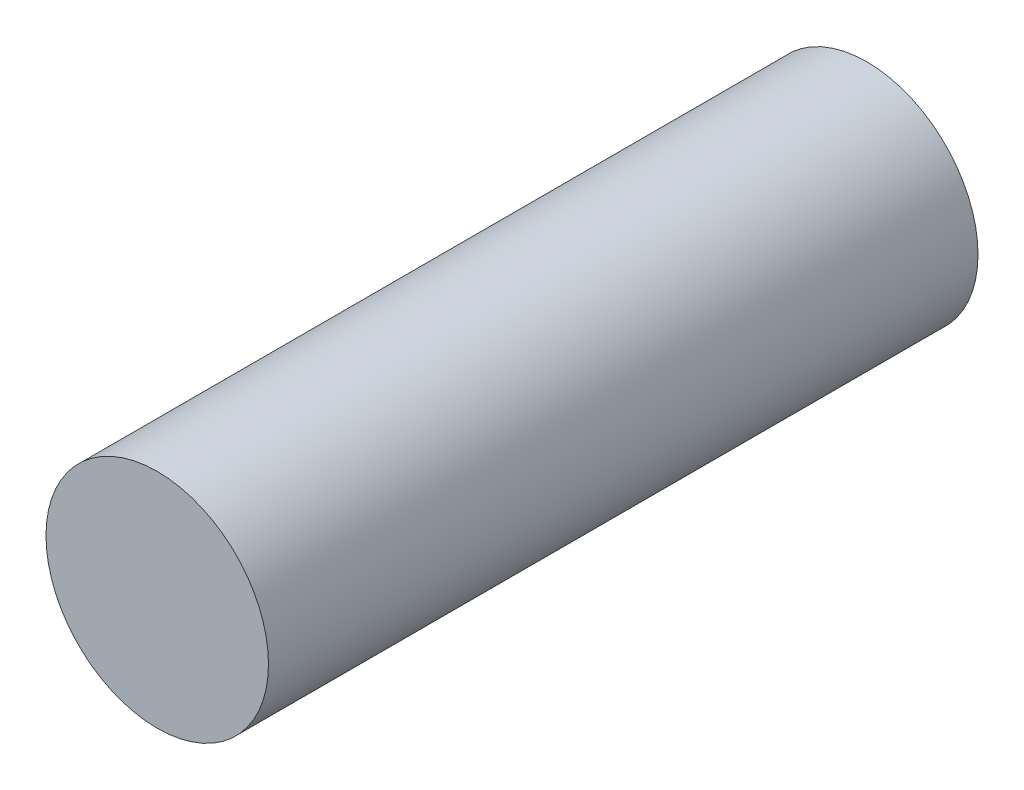
ISO-10303-21;
HEADER;
FILE_DESCRIPTION(('STEP AP214'),'2;1');
FILE_NAME('part.step','',(''),(''),'','','');
FILE_SCHEMA(('AUTOMOTIVE_DESIGN { 1 0 10303 214 1 1 1 1 }'));
ENDSEC;
DATA;
#1=APPLICATION_CONTEXT('core data for automotive mechanical design processes');
#2=APPLICATION_PROTOCOL_DEFINITION('international standard','automotive_design',2000,#1);
#3=PRODUCT_CONTEXT('',#1,'mechanical');
#4=PRODUCT('Part','Part','',(#3));
#5=PRODUCT_RELATED_PRODUCT_CATEGORY('part','',(#4));
#6=PRODUCT_DEFINITION_FORMATION('','',#4);
#7=PRODUCT_DEFINITION_CONTEXT('part definition',#1,'design');
#8=PRODUCT_DEFINITION('design','',#6,#7);
#9=PRODUCT_DEFINITION_SHAPE('','',#8);
#10=(LENGTH_UNIT() NAMED_UNIT(*) SI_UNIT(.MILLI.,.METRE.));
#11=(NAMED_UNIT(*) PLANE_ANGLE_UNIT() SI_UNIT($,.RADIAN.));
#12=(NAMED_UNIT(*) SI_UNIT($,.STERADIAN.) SOLID_ANGLE_UNIT());
#13=UNCERTAINTY_MEASURE_WITH_UNIT(LENGTH_MEASURE(1.E-05),#10,'distance_accuracy_value','');
#14=(GEOMETRIC_REPRESENTATION_CONTEXT(3) GLOBAL_UNCERTAINTY_ASSIGNED_CONTEXT((#13)) GLOBAL_UNIT_ASSIGNED_CONTEXT((#10,
#11,#12)) REPRESENTATION_CONTEXT('',''));
#15=CARTESIAN_POINT('',(0.,0.,0.));
#16=DIRECTION('',(0.,0.,1.));
#17=DIRECTION('',(1.,0.,0.));
#18=AXIS2_PLACEMENT_3D('',#15,#16,#17);
#19=CARTESIAN_POINT('',(0.,0.,13.3));
#20=DIRECTION('',(0.,0.,-1.));
#21=DIRECTION('',(-1.,0.,0.));
#22=AXIS2_PLACEMENT_3D('',#19,#20,#21);
#23=CYLINDRICAL_SURFACE('',#22,4.17);
#24=CARTESIAN_POINT('',(0.,0.,13.3));
#25=DIRECTION('',(0.,0.,1.));
#26=DIRECTION('',(1.,0.,0.));
#27=AXIS2_PLACEMENT_3D('',#24,#25,#26);
#28=CIRCLE('',#27,4.17);
#29=CARTESIAN_POINT('',(4.17,0.,13.3));
#30=VERTEX_POINT('',#29);
#31=EDGE_CURVE('E10',#30,#30,#28,.T.);
#32=ORIENTED_EDGE('',*,*,#31,.F.);
#33=EDGE_LOOP('',(#32));
#34=FACE_BOUND('',#33,.T.);
#35=CARTESIAN_POINT('',(0.,0.,-13.3));
#36=DIRECTION('',(0.,0.,1.));
#37=DIRECTION('',(1.,0.,0.));
#38=AXIS2_PLACEMENT_3D('',#35,#36,#37);
#39=CIRCLE('',#38,4.17);
#40=CARTESIAN_POINT('',(4.17,0.,-13.3));
#41=VERTEX_POINT('',#40);
#42=EDGE_CURVE('E46',#41,#41,#39,.T.);
#43=ORIENTED_EDGE('',*,*,#42,.T.);
#44=EDGE_LOOP('',(#43));
#45=FACE_BOUND('',#44,.T.);
#46=ADVANCED_FACE('F43',(#34,#45),#23,.T.);
#47=CARTESIAN_POINT('',(0.,0.,13.3));
#48=DIRECTION('',(0.,0.,1.));
#49=DIRECTION('',(1.,0.,0.));
#50=AXIS2_PLACEMENT_3D('',#47,#48,#49);
#51=PLANE('',#50);
#52=ORIENTED_EDGE('',*,*,#31,.T.);
#53=EDGE_LOOP('',(#52));
#54=FACE_BOUND('',#53,.T.);
#55=ADVANCED_FACE('F58',(#54),#51,.T.);
#56=CARTESIAN_POINT('',(0.,0.,-13.3));
#57=DIRECTION('',(0.,0.,1.));
#58=DIRECTION('',(1.,0.,0.));
#59=AXIS2_PLACEMENT_3D('',#56,#57,#58);
#60=PLANE('',#59);
#61=ORIENTED_EDGE('',*,*,#42,.F.);
#62=EDGE_LOOP('',(#61));
#63=FACE_BOUND('',#62,.T.);
#64=ADVANCED_FACE('F59',(#63),#60,.F.);
#65=CLOSED_SHELL('',(#46,#55,#64));
#66=MANIFOLD_SOLID_BREP('B2',#65);
#67=ADVANCED_BREP_SHAPE_REPRESENTATION('',(#18,#66),#14);
#68=SHAPE_DEFINITION_REPRESENTATION(#9,#67);
ENDSEC;
END-ISO-10303-21;
